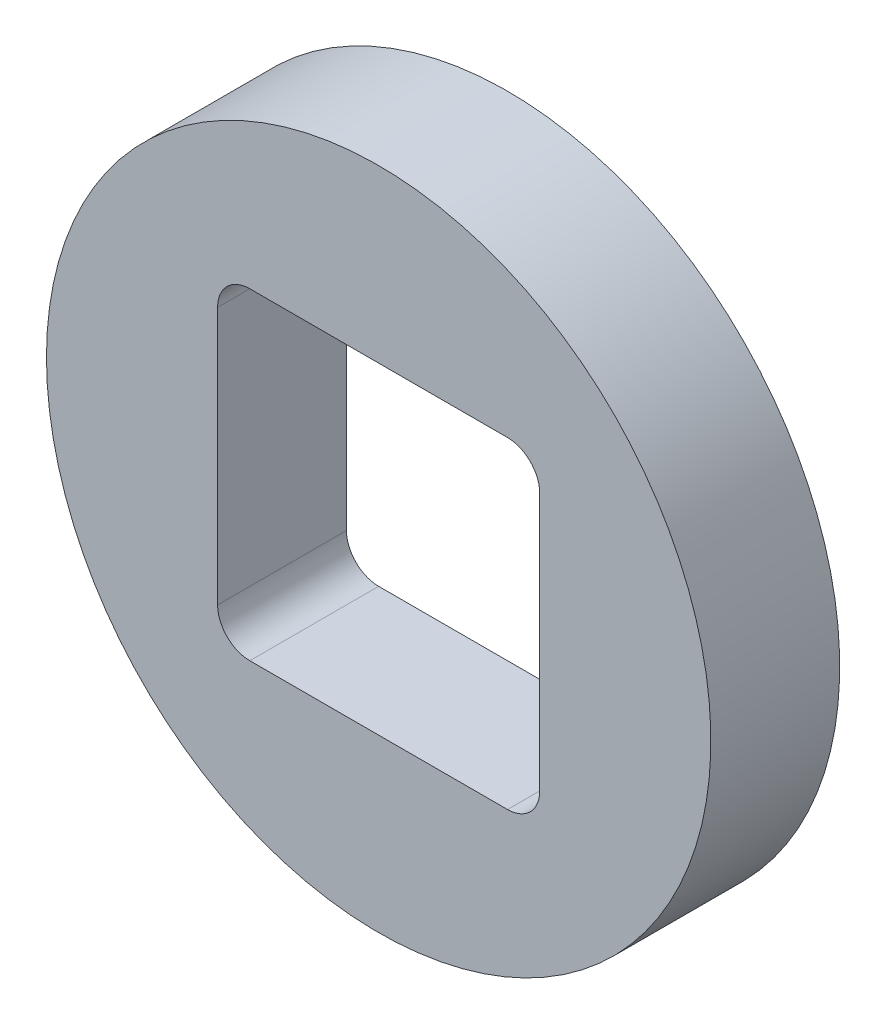
ISO-10303-21;
HEADER;
FILE_DESCRIPTION(('STEP AP214'),'2;1');
FILE_NAME('part.step','',(''),(''),'','','');
FILE_SCHEMA(('AUTOMOTIVE_DESIGN { 1 0 10303 214 1 1 1 1 }'));
ENDSEC;
DATA;
#1=APPLICATION_CONTEXT('core data for automotive mechanical design processes');
#2=APPLICATION_PROTOCOL_DEFINITION('international standard','automotive_design',2000,#1);
#3=PRODUCT_CONTEXT('',#1,'mechanical');
#4=PRODUCT('Part','Part','',(#3));
#5=PRODUCT_RELATED_PRODUCT_CATEGORY('part','',(#4));
#6=PRODUCT_DEFINITION_FORMATION('','',#4);
#7=PRODUCT_DEFINITION_CONTEXT('part definition',#1,'design');
#8=PRODUCT_DEFINITION('design','',#6,#7);
#9=PRODUCT_DEFINITION_SHAPE('','',#8);
#10=(LENGTH_UNIT() NAMED_UNIT(*) SI_UNIT(.MILLI.,.METRE.));
#11=(NAMED_UNIT(*) PLANE_ANGLE_UNIT() SI_UNIT($,.RADIAN.));
#12=(NAMED_UNIT(*) SI_UNIT($,.STERADIAN.) SOLID_ANGLE_UNIT());
#13=UNCERTAINTY_MEASURE_WITH_UNIT(LENGTH_MEASURE(1.E-05),#10,'distance_accuracy_value','');
#14=(GEOMETRIC_REPRESENTATION_CONTEXT(3) GLOBAL_UNCERTAINTY_ASSIGNED_CONTEXT((#13)) GLOBAL_UNIT_ASSIGNED_CONTEXT((#10,
#11,#12)) REPRESENTATION_CONTEXT('',''));
#15=CARTESIAN_POINT('',(0.,0.,0.));
#16=DIRECTION('',(0.,0.,1.));
#17=DIRECTION('',(1.,0.,0.));
#18=AXIS2_PLACEMENT_3D('',#15,#16,#17);
#19=CARTESIAN_POINT('',(-3.2,1.85,8.85));
#20=DIRECTION('',(0.,0.,1.));
#21=DIRECTION('',(1.,0.,0.));
#22=AXIS2_PLACEMENT_3D('',#19,#20,#21);
#23=CYLINDRICAL_SURFACE('',#22,0.8);
#24=DIRECTION('',(0.,0.,-1.));
#25=VECTOR('',#24,1.);
#26=CARTESIAN_POINT('',(-4.,1.85,12.05));
#27=LINE('',#26,#25);
#28=CARTESIAN_POINT('',(-4.,1.85,12.05));
#29=VERTEX_POINT('',#28);
#30=CARTESIAN_POINT('',(-4.,1.85,8.85));
#31=VERTEX_POINT('',#30);
#32=EDGE_CURVE('E140',#29,#31,#27,.T.);
#33=ORIENTED_EDGE('',*,*,#32,.T.);
#34=CARTESIAN_POINT('',(-3.2,1.85,8.85));
#35=DIRECTION('',(0.,0.,1.));
#36=DIRECTION('',(0.,1.,0.));
#37=AXIS2_PLACEMENT_3D('',#34,#35,#36);
#38=CIRCLE('',#37,0.8);
#39=CARTESIAN_POINT('',(-3.2,2.65,8.85));
#40=VERTEX_POINT('',#39);
#41=EDGE_CURVE('E145',#40,#31,#38,.T.);
#42=ORIENTED_EDGE('',*,*,#41,.F.);
#43=DIRECTION('',(0.,0.,1.));
#44=VECTOR('',#43,1.);
#45=CARTESIAN_POINT('',(-3.2,2.65,8.85));
#46=LINE('',#45,#44);
#47=CARTESIAN_POINT('',(-3.2,2.65,12.05));
#48=VERTEX_POINT('',#47);
#49=EDGE_CURVE('E213',#40,#48,#46,.T.);
#50=ORIENTED_EDGE('',*,*,#49,.T.);
#51=CARTESIAN_POINT('',(-3.2,1.85,12.05));
#52=DIRECTION('',(0.,0.,-1.));
#53=DIRECTION('',(-1.,0.,0.));
#54=AXIS2_PLACEMENT_3D('',#51,#52,#53);
#55=CIRCLE('',#54,0.8);
#56=EDGE_CURVE('E11',#29,#48,#55,.T.);
#57=ORIENTED_EDGE('',*,*,#56,.F.);
#58=EDGE_LOOP('',(#33,#42,#50,#57));
#59=FACE_BOUND('',#58,.T.);
#60=ADVANCED_FACE('F16',(#59),#23,.F.);
#61=CARTESIAN_POINT('',(0.,-1.35,12.05));
#62=DIRECTION('',(0.,0.,1.));
#63=DIRECTION('',(1.,0.,0.));
#64=AXIS2_PLACEMENT_3D('',#61,#62,#63);
#65=PLANE('',#64);
#66=CARTESIAN_POINT('',(0.,-1.35,12.05));
#67=DIRECTION('',(0.,0.,1.));
#68=DIRECTION('',(-1.,0.,0.));
#69=AXIS2_PLACEMENT_3D('',#66,#67,#68);
#70=CIRCLE('',#69,8.25);
#71=CARTESIAN_POINT('',(-8.25000000000003,-1.35,12.05));
#72=VERTEX_POINT('',#71);
#73=EDGE_CURVE('E20',#72,#72,#70,.T.);
#74=ORIENTED_EDGE('',*,*,#73,.T.);
#75=EDGE_LOOP('',(#74));
#76=FACE_BOUND('',#75,.T.);
#77=ORIENTED_EDGE('',*,*,#56,.T.);
#78=DIRECTION('',(-1.,0.,0.));
#79=VECTOR('',#78,1.);
#80=CARTESIAN_POINT('',(3.2,2.65,12.05));
#81=LINE('',#80,#79);
#82=CARTESIAN_POINT('',(3.2,2.65,12.05));
#83=VERTEX_POINT('',#82);
#84=EDGE_CURVE('E194',#83,#48,#81,.T.);
#85=ORIENTED_EDGE('',*,*,#84,.F.);
#86=CARTESIAN_POINT('',(3.2,1.85,12.05));
#87=DIRECTION('',(0.,0.,-1.));
#88=DIRECTION('',(0.,1.,0.));
#89=AXIS2_PLACEMENT_3D('',#86,#87,#88);
#90=CIRCLE('',#89,0.8);
#91=CARTESIAN_POINT('',(4.,1.85,12.05));
#92=VERTEX_POINT('',#91);
#93=EDGE_CURVE('E190',#83,#92,#90,.T.);
#94=ORIENTED_EDGE('',*,*,#93,.T.);
#95=DIRECTION('',(0.,1.,0.));
#96=VECTOR('',#95,1.);
#97=CARTESIAN_POINT('',(4.,-4.55,12.05));
#98=LINE('',#97,#96);
#99=CARTESIAN_POINT('',(4.,-4.55,12.05));
#100=VERTEX_POINT('',#99);
#101=EDGE_CURVE('E169',#100,#92,#98,.T.);
#102=ORIENTED_EDGE('',*,*,#101,.F.);
#103=CARTESIAN_POINT('',(3.2,-4.55,12.05));
#104=DIRECTION('',(0.,0.,-1.));
#105=DIRECTION('',(1.,0.,0.));
#106=AXIS2_PLACEMENT_3D('',#103,#104,#105);
#107=CIRCLE('',#106,0.8);
#108=CARTESIAN_POINT('',(3.2,-5.35,12.05));
#109=VERTEX_POINT('',#108);
#110=EDGE_CURVE('E115',#100,#109,#107,.T.);
#111=ORIENTED_EDGE('',*,*,#110,.T.);
#112=DIRECTION('',(1.,0.,0.));
#113=VECTOR('',#112,1.);
#114=CARTESIAN_POINT('',(-3.2,-5.35,12.05));
#115=LINE('',#114,#113);
#116=CARTESIAN_POINT('',(-3.2,-5.35,12.05));
#117=VERTEX_POINT('',#116);
#118=EDGE_CURVE('E113',#117,#109,#115,.T.);
#119=ORIENTED_EDGE('',*,*,#118,.F.);
#120=CARTESIAN_POINT('',(-3.2,-4.55,12.05));
#121=DIRECTION('',(0.,0.,-1.));
#122=DIRECTION('',(0.,-1.,0.));
#123=AXIS2_PLACEMENT_3D('',#120,#121,#122);
#124=CIRCLE('',#123,0.8);
#125=CARTESIAN_POINT('',(-4.,-4.55,12.05));
#126=VERTEX_POINT('',#125);
#127=EDGE_CURVE('E99',#117,#126,#124,.T.);
#128=ORIENTED_EDGE('',*,*,#127,.T.);
#129=DIRECTION('',(0.,-1.,0.));
#130=VECTOR('',#129,1.);
#131=CARTESIAN_POINT('',(-4.,1.85,12.05));
#132=LINE('',#131,#130);
#133=EDGE_CURVE('E143',#29,#126,#132,.T.);
#134=ORIENTED_EDGE('',*,*,#133,.F.);
#135=EDGE_LOOP('',(#77,#85,#94,#102,#111,#119,#128,#134));
#136=FACE_BOUND('',#135,.T.);
#137=ADVANCED_FACE('F18',(#76,#136),#65,.T.);
#138=CARTESIAN_POINT('',(0.,-1.35,8.85));
#139=DIRECTION('',(0.,0.,1.));
#140=DIRECTION('',(1.,0.,0.));
#141=AXIS2_PLACEMENT_3D('',#138,#139,#140);
#142=CYLINDRICAL_SURFACE('',#141,8.25);
#143=ORIENTED_EDGE('',*,*,#73,.F.);
#144=EDGE_LOOP('',(#143));
#145=FACE_BOUND('',#144,.T.);
#146=CARTESIAN_POINT('',(0.,-1.35,8.85));
#147=DIRECTION('',(0.,0.,-1.));
#148=DIRECTION('',(-1.,0.,0.));
#149=AXIS2_PLACEMENT_3D('',#146,#147,#148);
#150=CIRCLE('',#149,8.25);
#151=CARTESIAN_POINT('',(-8.25000000000003,-1.35,8.85));
#152=VERTEX_POINT('',#151);
#153=EDGE_CURVE('E146',#152,#152,#150,.T.);
#154=ORIENTED_EDGE('',*,*,#153,.F.);
#155=EDGE_LOOP('',(#154));
#156=FACE_BOUND('',#155,.T.);
#157=ADVANCED_FACE('F248',(#145,#156),#142,.T.);
#158=CARTESIAN_POINT('',(0.,-1.35,8.85));
#159=DIRECTION('',(0.,0.,1.));
#160=DIRECTION('',(1.,0.,0.));
#161=AXIS2_PLACEMENT_3D('',#158,#159,#160);
#162=PLANE('',#161);
#163=ORIENTED_EDGE('',*,*,#153,.T.);
#164=EDGE_LOOP('',(#163));
#165=FACE_BOUND('',#164,.T.);
#166=CARTESIAN_POINT('',(-3.2,-4.55,8.85));
#167=DIRECTION('',(0.,0.,1.));
#168=DIRECTION('',(-1.,0.,0.));
#169=AXIS2_PLACEMENT_3D('',#166,#167,#168);
#170=CIRCLE('',#169,0.8);
#171=CARTESIAN_POINT('',(-4.,-4.55,8.85));
#172=VERTEX_POINT('',#171);
#173=CARTESIAN_POINT('',(-3.2,-5.35,8.85));
#174=VERTEX_POINT('',#173);
#175=EDGE_CURVE('E120',#172,#174,#170,.T.);
#176=ORIENTED_EDGE('',*,*,#175,.T.);
#177=DIRECTION('',(1.,0.,0.));
#178=VECTOR('',#177,1.);
#179=CARTESIAN_POINT('',(-3.2,-5.35,8.85));
#180=LINE('',#179,#178);
#181=CARTESIAN_POINT('',(3.2,-5.35,8.85));
#182=VERTEX_POINT('',#181);
#183=EDGE_CURVE('E123',#174,#182,#180,.T.);
#184=ORIENTED_EDGE('',*,*,#183,.T.);
#185=CARTESIAN_POINT('',(3.2,-4.55,8.85));
#186=DIRECTION('',(0.,0.,1.));
#187=DIRECTION('',(0.,-1.,0.));
#188=AXIS2_PLACEMENT_3D('',#185,#186,#187);
#189=CIRCLE('',#188,0.8);
#190=CARTESIAN_POINT('',(4.,-4.55,8.85));
#191=VERTEX_POINT('',#190);
#192=EDGE_CURVE('E173',#182,#191,#189,.T.);
#193=ORIENTED_EDGE('',*,*,#192,.T.);
#194=DIRECTION('',(0.,1.,0.));
#195=VECTOR('',#194,1.);
#196=CARTESIAN_POINT('',(4.,-4.55,8.85));
#197=LINE('',#196,#195);
#198=CARTESIAN_POINT('',(4.,1.85,8.85));
#199=VERTEX_POINT('',#198);
#200=EDGE_CURVE('E170',#191,#199,#197,.T.);
#201=ORIENTED_EDGE('',*,*,#200,.T.);
#202=CARTESIAN_POINT('',(3.2,1.85,8.85));
#203=DIRECTION('',(0.,0.,1.));
#204=DIRECTION('',(1.,0.,0.));
#205=AXIS2_PLACEMENT_3D('',#202,#203,#204);
#206=CIRCLE('',#205,0.8);
#207=CARTESIAN_POINT('',(3.2,2.65,8.85));
#208=VERTEX_POINT('',#207);
#209=EDGE_CURVE('E163',#199,#208,#206,.T.);
#210=ORIENTED_EDGE('',*,*,#209,.T.);
#211=DIRECTION('',(-1.,0.,0.));
#212=VECTOR('',#211,1.);
#213=CARTESIAN_POINT('',(3.2,2.65,8.85));
#214=LINE('',#213,#212);
#215=EDGE_CURVE('E206',#208,#40,#214,.T.);
#216=ORIENTED_EDGE('',*,*,#215,.T.);
#217=ORIENTED_EDGE('',*,*,#41,.T.);
#218=DIRECTION('',(0.,-1.,0.));
#219=VECTOR('',#218,1.);
#220=CARTESIAN_POINT('',(-4.,1.85,8.85));
#221=LINE('',#220,#219);
#222=EDGE_CURVE('E110',#31,#172,#221,.T.);
#223=ORIENTED_EDGE('',*,*,#222,.T.);
#224=EDGE_LOOP('',(#176,#184,#193,#201,#210,#216,#217,#223));
#225=FACE_BOUND('',#224,.T.);
#226=ADVANCED_FACE('F224',(#165,#225),#162,.F.);
#227=CARTESIAN_POINT('',(-4.,-4.55,8.85));
#228=DIRECTION('',(1.,0.,0.));
#229=DIRECTION('',(0.,1.,0.));
#230=AXIS2_PLACEMENT_3D('',#227,#228,#229);
#231=PLANE('',#230);
#232=DIRECTION('',(0.,0.,1.));
#233=VECTOR('',#232,1.);
#234=CARTESIAN_POINT('',(-4.,-4.55,8.85));
#235=LINE('',#234,#233);
#236=EDGE_CURVE('E107',#172,#126,#235,.T.);
#237=ORIENTED_EDGE('',*,*,#236,.F.);
#238=ORIENTED_EDGE('',*,*,#222,.F.);
#239=ORIENTED_EDGE('',*,*,#32,.F.);
#240=ORIENTED_EDGE('',*,*,#133,.T.);
#241=EDGE_LOOP('',(#237,#238,#239,#240));
#242=FACE_BOUND('',#241,.T.);
#243=ADVANCED_FACE('F256',(#242),#231,.T.);
#244=CARTESIAN_POINT('',(-3.2,-4.55,8.85));
#245=DIRECTION('',(0.,0.,1.));
#246=DIRECTION('',(1.,0.,0.));
#247=AXIS2_PLACEMENT_3D('',#244,#245,#246);
#248=CYLINDRICAL_SURFACE('',#247,0.8);
#249=DIRECTION('',(0.,0.,-1.));
#250=VECTOR('',#249,1.);
#251=CARTESIAN_POINT('',(-3.2,-5.35,12.05));
#252=LINE('',#251,#250);
#253=EDGE_CURVE('E104',#117,#174,#252,.T.);
#254=ORIENTED_EDGE('',*,*,#253,.T.);
#255=ORIENTED_EDGE('',*,*,#175,.F.);
#256=ORIENTED_EDGE('',*,*,#236,.T.);
#257=ORIENTED_EDGE('',*,*,#127,.F.);
#258=EDGE_LOOP('',(#254,#255,#256,#257));
#259=FACE_BOUND('',#258,.T.);
#260=ADVANCED_FACE('F101',(#259),#248,.F.);
#261=CARTESIAN_POINT('',(0.,-5.35,8.85));
#262=DIRECTION('',(0.,1.,0.));
#263=DIRECTION('',(1.,0.,0.));
#264=AXIS2_PLACEMENT_3D('',#261,#262,#263);
#265=PLANE('',#264);
#266=DIRECTION('',(0.,0.,1.));
#267=VECTOR('',#266,1.);
#268=CARTESIAN_POINT('',(3.2,-5.35,8.85));
#269=LINE('',#268,#267);
#270=EDGE_CURVE('E132',#182,#109,#269,.T.);
#271=ORIENTED_EDGE('',*,*,#270,.F.);
#272=ORIENTED_EDGE('',*,*,#183,.F.);
#273=ORIENTED_EDGE('',*,*,#253,.F.);
#274=ORIENTED_EDGE('',*,*,#118,.T.);
#275=EDGE_LOOP('',(#271,#272,#273,#274));
#276=FACE_BOUND('',#275,.T.);
#277=ADVANCED_FACE('F122',(#276),#265,.T.);
#278=CARTESIAN_POINT('',(3.2,-4.55,8.85));
#279=DIRECTION('',(0.,0.,1.));
#280=DIRECTION('',(1.,0.,0.));
#281=AXIS2_PLACEMENT_3D('',#278,#279,#280);
#282=CYLINDRICAL_SURFACE('',#281,0.8);
#283=DIRECTION('',(0.,0.,-1.));
#284=VECTOR('',#283,1.);
#285=CARTESIAN_POINT('',(4.,-4.55,12.05));
#286=LINE('',#285,#284);
#287=EDGE_CURVE('E165',#100,#191,#286,.T.);
#288=ORIENTED_EDGE('',*,*,#287,.T.);
#289=ORIENTED_EDGE('',*,*,#192,.F.);
#290=ORIENTED_EDGE('',*,*,#270,.T.);
#291=ORIENTED_EDGE('',*,*,#110,.F.);
#292=EDGE_LOOP('',(#288,#289,#290,#291));
#293=FACE_BOUND('',#292,.T.);
#294=ADVANCED_FACE('F241',(#293),#282,.F.);
#295=CARTESIAN_POINT('',(4.,-1.35,8.85));
#296=DIRECTION('',(-1.,0.,0.));
#297=DIRECTION('',(0.,0.,1.));
#298=AXIS2_PLACEMENT_3D('',#295,#296,#297);
#299=PLANE('',#298);
#300=DIRECTION('',(0.,0.,1.));
#301=VECTOR('',#300,1.);
#302=CARTESIAN_POINT('',(4.,1.85,8.85));
#303=LINE('',#302,#301);
#304=EDGE_CURVE('E193',#199,#92,#303,.T.);
#305=ORIENTED_EDGE('',*,*,#304,.F.);
#306=ORIENTED_EDGE('',*,*,#200,.F.);
#307=ORIENTED_EDGE('',*,*,#287,.F.);
#308=ORIENTED_EDGE('',*,*,#101,.T.);
#309=EDGE_LOOP('',(#305,#306,#307,#308));
#310=FACE_BOUND('',#309,.T.);
#311=ADVANCED_FACE('F228',(#310),#299,.T.);
#312=CARTESIAN_POINT('',(3.2,1.85,8.85));
#313=DIRECTION('',(0.,0.,1.));
#314=DIRECTION('',(1.,0.,0.));
#315=AXIS2_PLACEMENT_3D('',#312,#313,#314);
#316=CYLINDRICAL_SURFACE('',#315,0.8);
#317=DIRECTION('',(0.,0.,-1.));
#318=VECTOR('',#317,1.);
#319=CARTESIAN_POINT('',(3.2,2.65,12.05));
#320=LINE('',#319,#318);
#321=EDGE_CURVE('E187',#83,#208,#320,.T.);
#322=ORIENTED_EDGE('',*,*,#321,.T.);
#323=ORIENTED_EDGE('',*,*,#209,.F.);
#324=ORIENTED_EDGE('',*,*,#304,.T.);
#325=ORIENTED_EDGE('',*,*,#93,.F.);
#326=EDGE_LOOP('',(#322,#323,#324,#325));
#327=FACE_BOUND('',#326,.T.);
#328=ADVANCED_FACE('F231',(#327),#316,.F.);
#329=CARTESIAN_POINT('',(0.,2.65,8.85));
#330=DIRECTION('',(0.,-1.,0.));
#331=DIRECTION('',(0.,0.,-1.));
#332=AXIS2_PLACEMENT_3D('',#329,#330,#331);
#333=PLANE('',#332);
#334=ORIENTED_EDGE('',*,*,#49,.F.);
#335=ORIENTED_EDGE('',*,*,#215,.F.);
#336=ORIENTED_EDGE('',*,*,#321,.F.);
#337=ORIENTED_EDGE('',*,*,#84,.T.);
#338=EDGE_LOOP('',(#334,#335,#336,#337));
#339=FACE_BOUND('',#338,.T.);
#340=ADVANCED_FACE('F233',(#339),#333,.T.);
#341=CLOSED_SHELL('',(#60,#137,#157,#226,#243,#260,#277,#294,#311,#328,#340));
#342=MANIFOLD_SOLID_BREP('B1',#341);
#343=ADVANCED_BREP_SHAPE_REPRESENTATION('',(#18,#342),#14);
#344=SHAPE_DEFINITION_REPRESENTATION(#9,#343);
ENDSEC;
END-ISO-10303-21;
